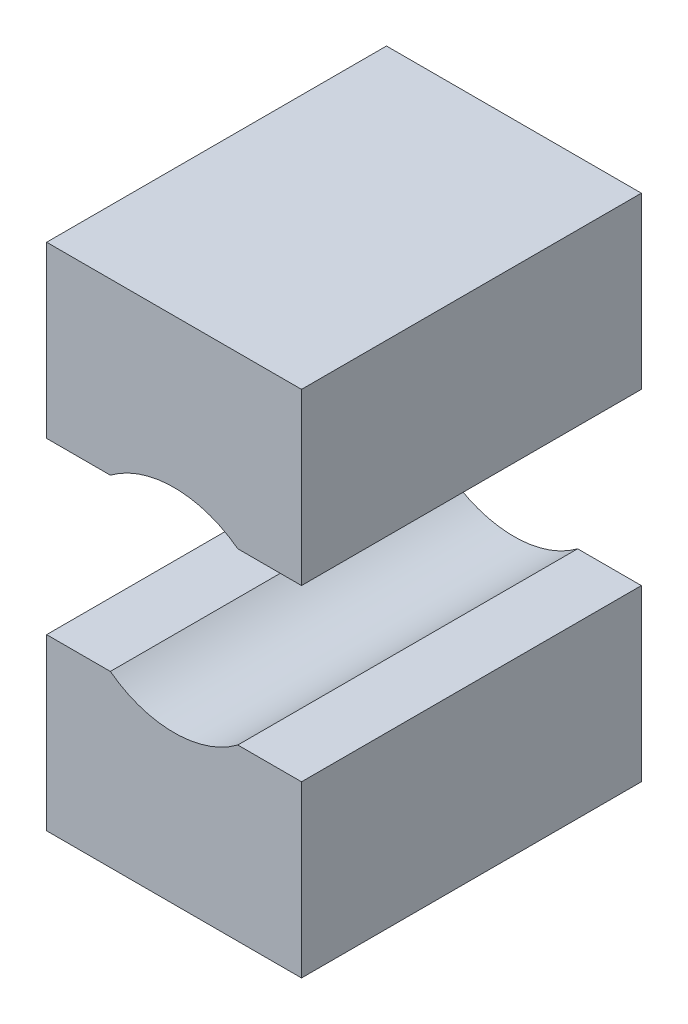
ISO-10303-21;
HEADER;
FILE_DESCRIPTION(('STEP AP214'),'2;1');
FILE_NAME('part.step','',(''),(''),'','','');
FILE_SCHEMA(('AUTOMOTIVE_DESIGN { 1 0 10303 214 1 1 1 1 }'));
ENDSEC;
DATA;
#1=APPLICATION_CONTEXT('core data for automotive mechanical design processes');
#2=APPLICATION_PROTOCOL_DEFINITION('international standard','automotive_design',2000,#1);
#3=PRODUCT_CONTEXT('',#1,'mechanical');
#4=PRODUCT('Part','Part','',(#3));
#5=PRODUCT_RELATED_PRODUCT_CATEGORY('part','',(#4));
#6=PRODUCT_DEFINITION_FORMATION('','',#4);
#7=PRODUCT_DEFINITION_CONTEXT('part definition',#1,'design');
#8=PRODUCT_DEFINITION('design','',#6,#7);
#9=PRODUCT_DEFINITION_SHAPE('','',#8);
#10=(LENGTH_UNIT() NAMED_UNIT(*) SI_UNIT(.MILLI.,.METRE.));
#11=(NAMED_UNIT(*) PLANE_ANGLE_UNIT() SI_UNIT($,.RADIAN.));
#12=(NAMED_UNIT(*) SI_UNIT($,.STERADIAN.) SOLID_ANGLE_UNIT());
#13=UNCERTAINTY_MEASURE_WITH_UNIT(LENGTH_MEASURE(1.E-05),#10,'distance_accuracy_value','');
#14=(GEOMETRIC_REPRESENTATION_CONTEXT(3) GLOBAL_UNCERTAINTY_ASSIGNED_CONTEXT((#13)) GLOBAL_UNIT_ASSIGNED_CONTEXT((#10,
#11,#12)) REPRESENTATION_CONTEXT('',''));
#15=CARTESIAN_POINT('',(0.,0.,0.));
#16=DIRECTION('',(0.,0.,1.));
#17=DIRECTION('',(1.,0.,0.));
#18=AXIS2_PLACEMENT_3D('',#15,#16,#17);
#19=CARTESIAN_POINT('',(-15.,-10.,-40.));
#20=DIRECTION('',(0.,1.,0.));
#21=DIRECTION('',(0.,0.,1.));
#22=AXIS2_PLACEMENT_3D('',#19,#20,#21);
#23=PLANE('',#22);
#24=DIRECTION('',(0.,0.,1.));
#25=VECTOR('',#24,1.);
#26=CARTESIAN_POINT('',(-7.5,-10.,-50.));
#27=LINE('',#26,#25);
#28=CARTESIAN_POINT('',(-7.5,-10.,-40.));
#29=VERTEX_POINT('',#28);
#30=CARTESIAN_POINT('',(-7.5,-10.,0.));
#31=VERTEX_POINT('',#30);
#32=EDGE_CURVE('E62',#29,#31,#27,.T.);
#33=ORIENTED_EDGE('',*,*,#32,.F.);
#34=DIRECTION('',(-1.,0.,0.));
#35=VECTOR('',#34,1.);
#36=CARTESIAN_POINT('',(-15.,-10.,-40.));
#37=LINE('',#36,#35);
#38=CARTESIAN_POINT('',(-15.,-10.,-40.));
#39=VERTEX_POINT('',#38);
#40=EDGE_CURVE('E144',#29,#39,#37,.T.);
#41=ORIENTED_EDGE('',*,*,#40,.T.);
#42=DIRECTION('',(0.,0.,1.));
#43=VECTOR('',#42,1.);
#44=CARTESIAN_POINT('',(-15.,-10.,-40.));
#45=LINE('',#44,#43);
#46=CARTESIAN_POINT('',(-15.,-10.,0.));
#47=VERTEX_POINT('',#46);
#48=EDGE_CURVE('E132',#39,#47,#45,.T.);
#49=ORIENTED_EDGE('',*,*,#48,.T.);
#50=DIRECTION('',(-1.,0.,0.));
#51=VECTOR('',#50,1.);
#52=CARTESIAN_POINT('',(-15.,-10.,0.));
#53=LINE('',#52,#51);
#54=EDGE_CURVE('E122',#31,#47,#53,.T.);
#55=ORIENTED_EDGE('',*,*,#54,.F.);
#56=EDGE_LOOP('',(#33,#41,#49,#55));
#57=FACE_BOUND('',#56,.T.);
#58=ADVANCED_FACE('F45',(#57),#23,.T.);
#59=CARTESIAN_POINT('',(15.,-10.,-40.));
#60=DIRECTION('',(1.,0.,0.));
#61=DIRECTION('',(0.,1.,0.));
#62=AXIS2_PLACEMENT_3D('',#59,#60,#61);
#63=PLANE('',#62);
#64=DIRECTION('',(0.,1.,0.));
#65=VECTOR('',#64,1.);
#66=CARTESIAN_POINT('',(15.,-10.,0.));
#67=LINE('',#66,#65);
#68=CARTESIAN_POINT('',(15.,-30.,0.));
#69=VERTEX_POINT('',#68);
#70=CARTESIAN_POINT('',(15.,-10.,0.));
#71=VERTEX_POINT('',#70);
#72=EDGE_CURVE('E120',#69,#71,#67,.T.);
#73=ORIENTED_EDGE('',*,*,#72,.F.);
#74=DIRECTION('',(0.,0.,1.));
#75=VECTOR('',#74,1.);
#76=CARTESIAN_POINT('',(15.,-30.,-40.));
#77=LINE('',#76,#75);
#78=CARTESIAN_POINT('',(15.,-30.,-40.));
#79=VERTEX_POINT('',#78);
#80=EDGE_CURVE('E12',#79,#69,#77,.T.);
#81=ORIENTED_EDGE('',*,*,#80,.F.);
#82=DIRECTION('',(0.,1.,0.));
#83=VECTOR('',#82,1.);
#84=CARTESIAN_POINT('',(15.,-10.,-40.));
#85=LINE('',#84,#83);
#86=CARTESIAN_POINT('',(15.,-10.,-40.));
#87=VERTEX_POINT('',#86);
#88=EDGE_CURVE('E130',#79,#87,#85,.T.);
#89=ORIENTED_EDGE('',*,*,#88,.T.);
#90=DIRECTION('',(0.,0.,1.));
#91=VECTOR('',#90,1.);
#92=CARTESIAN_POINT('',(15.,-10.,-40.));
#93=LINE('',#92,#91);
#94=EDGE_CURVE('E49',#87,#71,#93,.T.);
#95=ORIENTED_EDGE('',*,*,#94,.T.);
#96=EDGE_LOOP('',(#73,#81,#89,#95));
#97=FACE_BOUND('',#96,.T.);
#98=ADVANCED_FACE('F47',(#97),#63,.T.);
#99=CARTESIAN_POINT('',(-15.,-30.,-40.));
#100=DIRECTION('',(0.,-1.,0.));
#101=DIRECTION('',(0.,0.,-1.));
#102=AXIS2_PLACEMENT_3D('',#99,#100,#101);
#103=PLANE('',#102);
#104=DIRECTION('',(1.,0.,0.));
#105=VECTOR('',#104,1.);
#106=CARTESIAN_POINT('',(-15.,-30.,0.));
#107=LINE('',#106,#105);
#108=CARTESIAN_POINT('',(-15.,-30.,0.));
#109=VERTEX_POINT('',#108);
#110=EDGE_CURVE('E125',#109,#69,#107,.T.);
#111=ORIENTED_EDGE('',*,*,#110,.F.);
#112=DIRECTION('',(0.,0.,1.));
#113=VECTOR('',#112,1.);
#114=CARTESIAN_POINT('',(-15.,-30.,-40.));
#115=LINE('',#114,#113);
#116=CARTESIAN_POINT('',(-15.,-30.,-40.));
#117=VERTEX_POINT('',#116);
#118=EDGE_CURVE('E54',#117,#109,#115,.T.);
#119=ORIENTED_EDGE('',*,*,#118,.F.);
#120=DIRECTION('',(1.,0.,0.));
#121=VECTOR('',#120,1.);
#122=CARTESIAN_POINT('',(-15.,-30.,-40.));
#123=LINE('',#122,#121);
#124=EDGE_CURVE('E137',#117,#79,#123,.T.);
#125=ORIENTED_EDGE('',*,*,#124,.T.);
#126=ORIENTED_EDGE('',*,*,#80,.T.);
#127=EDGE_LOOP('',(#111,#119,#125,#126));
#128=FACE_BOUND('',#127,.T.);
#129=ADVANCED_FACE('F152',(#128),#103,.T.);
#130=CARTESIAN_POINT('',(-15.,-10.,-40.));
#131=DIRECTION('',(-1.,0.,0.));
#132=DIRECTION('',(0.,0.,1.));
#133=AXIS2_PLACEMENT_3D('',#130,#131,#132);
#134=PLANE('',#133);
#135=DIRECTION('',(0.,-1.,0.));
#136=VECTOR('',#135,1.);
#137=CARTESIAN_POINT('',(-15.,-10.,0.));
#138=LINE('',#137,#136);
#139=EDGE_CURVE('E121',#47,#109,#138,.T.);
#140=ORIENTED_EDGE('',*,*,#139,.F.);
#141=ORIENTED_EDGE('',*,*,#48,.F.);
#142=DIRECTION('',(0.,-1.,0.));
#143=VECTOR('',#142,1.);
#144=CARTESIAN_POINT('',(-15.,-10.,-40.));
#145=LINE('',#144,#143);
#146=EDGE_CURVE('E138',#39,#117,#145,.T.);
#147=ORIENTED_EDGE('',*,*,#146,.T.);
#148=ORIENTED_EDGE('',*,*,#118,.T.);
#149=EDGE_LOOP('',(#140,#141,#147,#148));
#150=FACE_BOUND('',#149,.T.);
#151=ADVANCED_FACE('F153',(#150),#134,.T.);
#152=DIRECTION('',(0.,0.,1.));
#153=VECTOR('',#152,1.);
#154=CARTESIAN_POINT('',(7.5,-10.,-50.));
#155=LINE('',#154,#153);
#156=CARTESIAN_POINT('',(7.5,-10.,0.));
#157=VERTEX_POINT('',#156);
#158=CARTESIAN_POINT('',(7.5,-10.,-40.));
#159=VERTEX_POINT('',#158);
#160=EDGE_CURVE('E106',#157,#159,#155,.F.);
#161=ORIENTED_EDGE('',*,*,#160,.F.);
#162=EDGE_CURVE('E114',#71,#157,#53,.T.);
#163=ORIENTED_EDGE('',*,*,#162,.F.);
#164=ORIENTED_EDGE('',*,*,#94,.F.);
#165=EDGE_CURVE('E116',#87,#159,#37,.T.);
#166=ORIENTED_EDGE('',*,*,#165,.T.);
#167=EDGE_LOOP('',(#161,#163,#164,#166));
#168=FACE_BOUND('',#167,.T.);
#169=ADVANCED_FACE('F113',(#168),#23,.T.);
#170=CARTESIAN_POINT('',(0.,0.,-40.));
#171=DIRECTION('',(0.,0.,1.));
#172=DIRECTION('',(1.,0.,0.));
#173=AXIS2_PLACEMENT_3D('',#170,#171,#172);
#174=PLANE('',#173);
#175=ORIENTED_EDGE('',*,*,#40,.F.);
#176=CARTESIAN_POINT('',(0.,0.,-40.));
#177=DIRECTION('',(0.,0.,1.));
#178=DIRECTION('',(1.,0.,0.));
#179=AXIS2_PLACEMENT_3D('',#176,#177,#178);
#180=CIRCLE('',#179,12.5);
#181=EDGE_CURVE('E111',#29,#159,#180,.T.);
#182=ORIENTED_EDGE('',*,*,#181,.T.);
#183=ORIENTED_EDGE('',*,*,#165,.F.);
#184=ORIENTED_EDGE('',*,*,#88,.F.);
#185=ORIENTED_EDGE('',*,*,#124,.F.);
#186=ORIENTED_EDGE('',*,*,#146,.F.);
#187=EDGE_LOOP('',(#175,#182,#183,#184,#185,#186));
#188=FACE_BOUND('',#187,.T.);
#189=ADVANCED_FACE('F149',(#188),#174,.F.);
#190=CARTESIAN_POINT('',(0.,0.,0.));
#191=DIRECTION('',(0.,0.,1.));
#192=DIRECTION('',(1.,0.,0.));
#193=AXIS2_PLACEMENT_3D('',#190,#191,#192);
#194=PLANE('',#193);
#195=CARTESIAN_POINT('',(0.,0.,0.));
#196=DIRECTION('',(0.,0.,1.));
#197=DIRECTION('',(1.,0.,0.));
#198=AXIS2_PLACEMENT_3D('',#195,#196,#197);
#199=CIRCLE('',#198,12.5);
#200=EDGE_CURVE('E103',#31,#157,#199,.T.);
#201=ORIENTED_EDGE('',*,*,#200,.F.);
#202=ORIENTED_EDGE('',*,*,#54,.T.);
#203=ORIENTED_EDGE('',*,*,#139,.T.);
#204=ORIENTED_EDGE('',*,*,#110,.T.);
#205=ORIENTED_EDGE('',*,*,#72,.T.);
#206=ORIENTED_EDGE('',*,*,#162,.T.);
#207=EDGE_LOOP('',(#201,#202,#203,#204,#205,#206));
#208=FACE_BOUND('',#207,.T.);
#209=ADVANCED_FACE('F118',(#208),#194,.T.);
#210=CARTESIAN_POINT('',(0.,0.,-50.));
#211=DIRECTION('',(0.,0.,1.));
#212=DIRECTION('',(1.,0.,0.));
#213=AXIS2_PLACEMENT_3D('',#210,#211,#212);
#214=CYLINDRICAL_SURFACE('',#213,12.5);
#215=ORIENTED_EDGE('',*,*,#32,.T.);
#216=ORIENTED_EDGE('',*,*,#200,.T.);
#217=ORIENTED_EDGE('',*,*,#160,.T.);
#218=ORIENTED_EDGE('',*,*,#181,.F.);
#219=EDGE_LOOP('',(#215,#216,#217,#218));
#220=FACE_BOUND('',#219,.T.);
#221=ADVANCED_FACE('F105',(#220),#214,.F.);
#222=CLOSED_SHELL('',(#58,#98,#129,#151,#169,#189,#209,#221));
#223=MANIFOLD_SOLID_BREP('B2',#222);
#224=CARTESIAN_POINT('',(-15.,10.,-40.));
#225=DIRECTION('',(0.,-1.,0.));
#226=DIRECTION('',(1.,0.,0.));
#227=AXIS2_PLACEMENT_3D('',#224,#225,#226);
#228=PLANE('',#227);
#229=DIRECTION('',(0.,0.,1.));
#230=VECTOR('',#229,1.);
#231=CARTESIAN_POINT('',(7.50000000000001,10.,-50.));
#232=LINE('',#231,#230);
#233=CARTESIAN_POINT('',(7.50000000000001,10.,-40.));
#234=VERTEX_POINT('',#233);
#235=CARTESIAN_POINT('',(7.50000000000001,10.,0.));
#236=VERTEX_POINT('',#235);
#237=EDGE_CURVE('E235',#234,#236,#232,.T.);
#238=ORIENTED_EDGE('',*,*,#237,.F.);
#239=DIRECTION('',(1.,0.,0.));
#240=VECTOR('',#239,1.);
#241=CARTESIAN_POINT('',(-15.,10.,-40.));
#242=LINE('',#241,#240);
#243=CARTESIAN_POINT('',(15.,10.,-40.));
#244=VERTEX_POINT('',#243);
#245=EDGE_CURVE('E242',#234,#244,#242,.T.);
#246=ORIENTED_EDGE('',*,*,#245,.T.);
#247=DIRECTION('',(0.,0.,1.));
#248=VECTOR('',#247,1.);
#249=CARTESIAN_POINT('',(15.,10.,-40.));
#250=LINE('',#249,#248);
#251=CARTESIAN_POINT('',(15.,10.,0.));
#252=VERTEX_POINT('',#251);
#253=EDGE_CURVE('E43',#244,#252,#250,.T.);
#254=ORIENTED_EDGE('',*,*,#253,.T.);
#255=DIRECTION('',(1.,0.,0.));
#256=VECTOR('',#255,1.);
#257=CARTESIAN_POINT('',(-15.,10.,0.));
#258=LINE('',#257,#256);
#259=EDGE_CURVE('E264',#236,#252,#258,.T.);
#260=ORIENTED_EDGE('',*,*,#259,.F.);
#261=EDGE_LOOP('',(#238,#246,#254,#260));
#262=FACE_BOUND('',#261,.T.);
#263=ADVANCED_FACE('F218',(#262),#228,.T.);
#264=CARTESIAN_POINT('',(15.,30.,-40.));
#265=DIRECTION('',(1.,0.,0.));
#266=DIRECTION('',(0.,1.,0.));
#267=AXIS2_PLACEMENT_3D('',#264,#265,#266);
#268=PLANE('',#267);
#269=DIRECTION('',(0.,1.,0.));
#270=VECTOR('',#269,1.);
#271=CARTESIAN_POINT('',(15.,30.,0.));
#272=LINE('',#271,#270);
#273=CARTESIAN_POINT('',(15.,30.,0.));
#274=VERTEX_POINT('',#273);
#275=EDGE_CURVE('E315',#252,#274,#272,.T.);
#276=ORIENTED_EDGE('',*,*,#275,.F.);
#277=ORIENTED_EDGE('',*,*,#253,.F.);
#278=DIRECTION('',(0.,1.,0.));
#279=VECTOR('',#278,1.);
#280=CARTESIAN_POINT('',(15.,30.,-40.));
#281=LINE('',#280,#279);
#282=CARTESIAN_POINT('',(15.,30.,-40.));
#283=VERTEX_POINT('',#282);
#284=EDGE_CURVE('E299',#244,#283,#281,.T.);
#285=ORIENTED_EDGE('',*,*,#284,.T.);
#286=DIRECTION('',(0.,0.,1.));
#287=VECTOR('',#286,1.);
#288=CARTESIAN_POINT('',(15.,30.,-40.));
#289=LINE('',#288,#287);
#290=EDGE_CURVE('E222',#283,#274,#289,.T.);
#291=ORIENTED_EDGE('',*,*,#290,.T.);
#292=EDGE_LOOP('',(#276,#277,#285,#291));
#293=FACE_BOUND('',#292,.T.);
#294=ADVANCED_FACE('F220',(#293),#268,.T.);
#295=DIRECTION('',(0.,0.,1.));
#296=VECTOR('',#295,1.);
#297=CARTESIAN_POINT('',(-7.5,10.,-50.));
#298=LINE('',#297,#296);
#299=CARTESIAN_POINT('',(-7.5,10.,0.));
#300=VERTEX_POINT('',#299);
#301=CARTESIAN_POINT('',(-7.5,10.,-40.));
#302=VERTEX_POINT('',#301);
#303=EDGE_CURVE('E281',#300,#302,#298,.F.);
#304=ORIENTED_EDGE('',*,*,#303,.F.);
#305=CARTESIAN_POINT('',(-15.,10.,0.));
#306=VERTEX_POINT('',#305);
#307=EDGE_CURVE('E290',#306,#300,#258,.T.);
#308=ORIENTED_EDGE('',*,*,#307,.F.);
#309=DIRECTION('',(0.,0.,1.));
#310=VECTOR('',#309,1.);
#311=CARTESIAN_POINT('',(-15.,10.,-40.));
#312=LINE('',#311,#310);
#313=CARTESIAN_POINT('',(-15.,10.,-40.));
#314=VERTEX_POINT('',#313);
#315=EDGE_CURVE('E227',#314,#306,#312,.T.);
#316=ORIENTED_EDGE('',*,*,#315,.F.);
#317=EDGE_CURVE('E292',#314,#302,#242,.T.);
#318=ORIENTED_EDGE('',*,*,#317,.T.);
#319=EDGE_LOOP('',(#304,#308,#316,#318));
#320=FACE_BOUND('',#319,.T.);
#321=ADVANCED_FACE('F289',(#320),#228,.T.);
#322=CARTESIAN_POINT('',(-15.,30.,-40.));
#323=DIRECTION('',(-1.,0.,0.));
#324=DIRECTION('',(0.,-1.,0.));
#325=AXIS2_PLACEMENT_3D('',#322,#323,#324);
#326=PLANE('',#325);
#327=DIRECTION('',(0.,-1.,0.));
#328=VECTOR('',#327,1.);
#329=CARTESIAN_POINT('',(-15.,30.,0.));
#330=LINE('',#329,#328);
#331=CARTESIAN_POINT('',(-15.,30.,0.));
#332=VERTEX_POINT('',#331);
#333=EDGE_CURVE('E298',#332,#306,#330,.T.);
#334=ORIENTED_EDGE('',*,*,#333,.F.);
#335=DIRECTION('',(0.,0.,1.));
#336=VECTOR('',#335,1.);
#337=CARTESIAN_POINT('',(-15.,30.,-40.));
#338=LINE('',#337,#336);
#339=CARTESIAN_POINT('',(-15.,30.,-40.));
#340=VERTEX_POINT('',#339);
#341=EDGE_CURVE('E307',#340,#332,#338,.T.);
#342=ORIENTED_EDGE('',*,*,#341,.F.);
#343=DIRECTION('',(0.,-1.,0.));
#344=VECTOR('',#343,1.);
#345=CARTESIAN_POINT('',(-15.,30.,-40.));
#346=LINE('',#345,#344);
#347=EDGE_CURVE('E311',#340,#314,#346,.T.);
#348=ORIENTED_EDGE('',*,*,#347,.T.);
#349=ORIENTED_EDGE('',*,*,#315,.T.);
#350=EDGE_LOOP('',(#334,#342,#348,#349));
#351=FACE_BOUND('',#350,.T.);
#352=ADVANCED_FACE('F320',(#351),#326,.T.);
#353=CARTESIAN_POINT('',(-15.,30.,-40.));
#354=DIRECTION('',(0.,1.,0.));
#355=DIRECTION('',(-1.,0.,0.));
#356=AXIS2_PLACEMENT_3D('',#353,#354,#355);
#357=PLANE('',#356);
#358=DIRECTION('',(-1.,0.,0.));
#359=VECTOR('',#358,1.);
#360=CARTESIAN_POINT('',(-15.,30.,0.));
#361=LINE('',#360,#359);
#362=EDGE_CURVE('E316',#274,#332,#361,.T.);
#363=ORIENTED_EDGE('',*,*,#362,.F.);
#364=ORIENTED_EDGE('',*,*,#290,.F.);
#365=DIRECTION('',(-1.,0.,0.));
#366=VECTOR('',#365,1.);
#367=CARTESIAN_POINT('',(-15.,30.,-40.));
#368=LINE('',#367,#366);
#369=EDGE_CURVE('E302',#283,#340,#368,.T.);
#370=ORIENTED_EDGE('',*,*,#369,.T.);
#371=ORIENTED_EDGE('',*,*,#341,.T.);
#372=EDGE_LOOP('',(#363,#364,#370,#371));
#373=FACE_BOUND('',#372,.T.);
#374=ADVANCED_FACE('F317',(#373),#357,.T.);
#375=CARTESIAN_POINT('',(0.,0.,-40.));
#376=DIRECTION('',(0.,0.,1.));
#377=DIRECTION('',(1.,0.,0.));
#378=AXIS2_PLACEMENT_3D('',#375,#376,#377);
#379=PLANE('',#378);
#380=ORIENTED_EDGE('',*,*,#245,.F.);
#381=CARTESIAN_POINT('',(0.,0.,-40.));
#382=DIRECTION('',(0.,0.,1.));
#383=DIRECTION('',(1.,0.,0.));
#384=AXIS2_PLACEMENT_3D('',#381,#382,#383);
#385=CIRCLE('',#384,12.5);
#386=EDGE_CURVE('E284',#234,#302,#385,.T.);
#387=ORIENTED_EDGE('',*,*,#386,.T.);
#388=ORIENTED_EDGE('',*,*,#317,.F.);
#389=ORIENTED_EDGE('',*,*,#347,.F.);
#390=ORIENTED_EDGE('',*,*,#369,.F.);
#391=ORIENTED_EDGE('',*,*,#284,.F.);
#392=EDGE_LOOP('',(#380,#387,#388,#389,#390,#391));
#393=FACE_BOUND('',#392,.T.);
#394=ADVANCED_FACE('F319',(#393),#379,.F.);
#395=CARTESIAN_POINT('',(0.,0.,0.));
#396=DIRECTION('',(0.,0.,1.));
#397=DIRECTION('',(1.,0.,0.));
#398=AXIS2_PLACEMENT_3D('',#395,#396,#397);
#399=PLANE('',#398);
#400=CARTESIAN_POINT('',(0.,0.,0.));
#401=DIRECTION('',(0.,0.,1.));
#402=DIRECTION('',(1.,0.,0.));
#403=AXIS2_PLACEMENT_3D('',#400,#401,#402);
#404=CIRCLE('',#403,12.5);
#405=EDGE_CURVE('E278',#236,#300,#404,.T.);
#406=ORIENTED_EDGE('',*,*,#405,.F.);
#407=ORIENTED_EDGE('',*,*,#259,.T.);
#408=ORIENTED_EDGE('',*,*,#275,.T.);
#409=ORIENTED_EDGE('',*,*,#362,.T.);
#410=ORIENTED_EDGE('',*,*,#333,.T.);
#411=ORIENTED_EDGE('',*,*,#307,.T.);
#412=EDGE_LOOP('',(#406,#407,#408,#409,#410,#411));
#413=FACE_BOUND('',#412,.T.);
#414=ADVANCED_FACE('F295',(#413),#399,.T.);
#415=CARTESIAN_POINT('',(0.,0.,-50.));
#416=DIRECTION('',(0.,0.,1.));
#417=DIRECTION('',(1.,0.,0.));
#418=AXIS2_PLACEMENT_3D('',#415,#416,#417);
#419=CYLINDRICAL_SURFACE('',#418,12.5);
#420=ORIENTED_EDGE('',*,*,#237,.T.);
#421=ORIENTED_EDGE('',*,*,#405,.T.);
#422=ORIENTED_EDGE('',*,*,#303,.T.);
#423=ORIENTED_EDGE('',*,*,#386,.F.);
#424=EDGE_LOOP('',(#420,#421,#422,#423));
#425=FACE_BOUND('',#424,.T.);
#426=ADVANCED_FACE('F280',(#425),#419,.F.);
#427=CLOSED_SHELL('',(#263,#294,#321,#352,#374,#394,#414,#426));
#428=MANIFOLD_SOLID_BREP('B6',#427);
#429=ADVANCED_BREP_SHAPE_REPRESENTATION('',(#18,#223,#428),#14);
#430=SHAPE_DEFINITION_REPRESENTATION(#9,#429);
ENDSEC;
END-ISO-10303-21;
